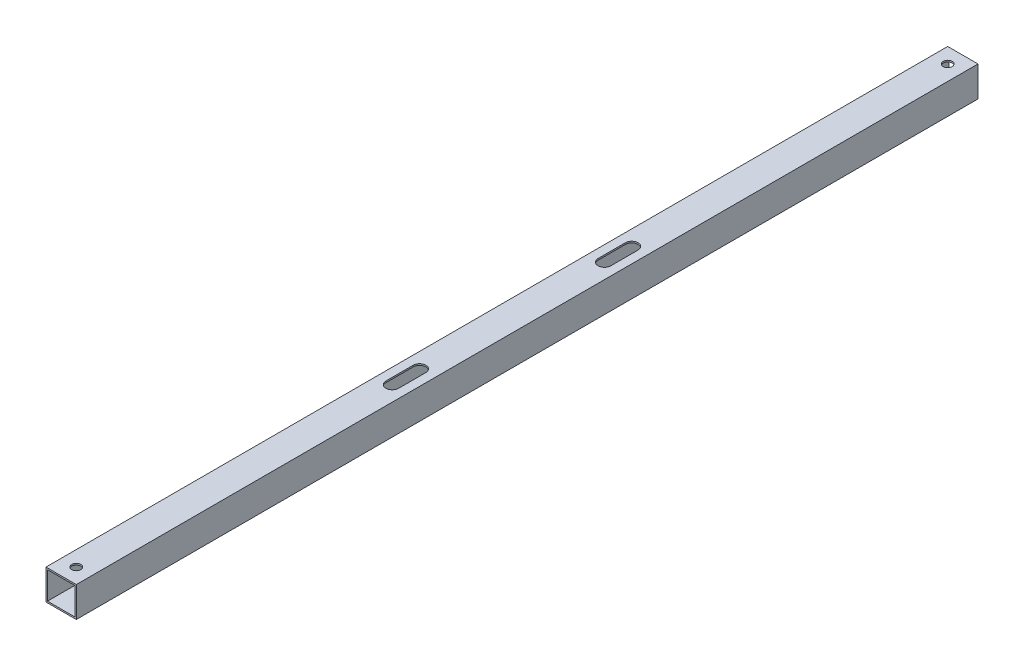
ISO-10303-21;
HEADER;
FILE_DESCRIPTION(('STEP AP214'),'2;1');
FILE_NAME('part.step','',(''),(''),'','','');
FILE_SCHEMA(('AUTOMOTIVE_DESIGN { 1 0 10303 214 1 1 1 1 }'));
ENDSEC;
DATA;
#1=APPLICATION_CONTEXT('core data for automotive mechanical design processes');
#2=APPLICATION_PROTOCOL_DEFINITION('international standard','automotive_design',2000,#1);
#3=PRODUCT_CONTEXT('',#1,'mechanical');
#4=PRODUCT('Part','Part','',(#3));
#5=PRODUCT_RELATED_PRODUCT_CATEGORY('part','',(#4));
#6=PRODUCT_DEFINITION_FORMATION('','',#4);
#7=PRODUCT_DEFINITION_CONTEXT('part definition',#1,'design');
#8=PRODUCT_DEFINITION('design','',#6,#7);
#9=PRODUCT_DEFINITION_SHAPE('','',#8);
#10=(LENGTH_UNIT() NAMED_UNIT(*) SI_UNIT(.MILLI.,.METRE.));
#11=(NAMED_UNIT(*) PLANE_ANGLE_UNIT() SI_UNIT($,.RADIAN.));
#12=(NAMED_UNIT(*) SI_UNIT($,.STERADIAN.) SOLID_ANGLE_UNIT());
#13=UNCERTAINTY_MEASURE_WITH_UNIT(LENGTH_MEASURE(1.E-05),#10,'distance_accuracy_value','');
#14=(GEOMETRIC_REPRESENTATION_CONTEXT(3) GLOBAL_UNCERTAINTY_ASSIGNED_CONTEXT((#13)) GLOBAL_UNIT_ASSIGNED_CONTEXT((#10,
#11,#12)) REPRESENTATION_CONTEXT('',''));
#15=CARTESIAN_POINT('',(0.,0.,0.));
#16=DIRECTION('',(0.,0.,1.));
#17=DIRECTION('',(1.,0.,0.));
#18=AXIS2_PLACEMENT_3D('',#15,#16,#17);
#19=CARTESIAN_POINT('',(-10.,10.,297.5));
#20=DIRECTION('',(0.,-1.,0.));
#21=DIRECTION('',(0.,0.,-1.));
#22=AXIS2_PLACEMENT_3D('',#19,#20,#21);
#23=PLANE('',#22);
#24=DIRECTION('',(-1.,0.,0.));
#25=VECTOR('',#24,1.);
#26=CARTESIAN_POINT('',(-10.,10.,-297.5));
#27=LINE('',#26,#25);
#28=CARTESIAN_POINT('',(10.,10.,-297.5));
#29=VERTEX_POINT('',#28);
#30=CARTESIAN_POINT('',(-10.,10.,-297.5));
#31=VERTEX_POINT('',#30);
#32=EDGE_CURVE('E291',#29,#31,#27,.T.);
#33=ORIENTED_EDGE('',*,*,#32,.T.);
#34=DIRECTION('',(0.,0.,-1.));
#35=VECTOR('',#34,1.);
#36=CARTESIAN_POINT('',(-10.,10.,297.5));
#37=LINE('',#36,#35);
#38=CARTESIAN_POINT('',(-10.,10.,297.5));
#39=VERTEX_POINT('',#38);
#40=EDGE_CURVE('E43',#39,#31,#37,.T.);
#41=ORIENTED_EDGE('',*,*,#40,.F.);
#42=DIRECTION('',(-1.,0.,0.));
#43=VECTOR('',#42,1.);
#44=CARTESIAN_POINT('',(-10.,10.,297.5));
#45=LINE('',#44,#43);
#46=CARTESIAN_POINT('',(10.,10.,297.5));
#47=VERTEX_POINT('',#46);
#48=EDGE_CURVE('E281',#47,#39,#45,.T.);
#49=ORIENTED_EDGE('',*,*,#48,.F.);
#50=DIRECTION('',(0.,0.,-1.));
#51=VECTOR('',#50,1.);
#52=CARTESIAN_POINT('',(10.,10.,297.5));
#53=LINE('',#52,#51);
#54=EDGE_CURVE('E11',#47,#29,#53,.T.);
#55=ORIENTED_EDGE('',*,*,#54,.T.);
#56=EDGE_LOOP('',(#33,#41,#49,#55));
#57=FACE_BOUND('',#56,.T.);
#58=CARTESIAN_POINT('',(0.,10.,287.5));
#59=DIRECTION('',(0.,1.,0.));
#60=DIRECTION('',(0.,0.,1.));
#61=AXIS2_PLACEMENT_3D('',#58,#59,#60);
#62=CIRCLE('',#61,3.);
#63=CARTESIAN_POINT('',(0.,10.,290.5));
#64=VERTEX_POINT('',#63);
#65=EDGE_CURVE('E242',#64,#64,#62,.T.);
#66=ORIENTED_EDGE('',*,*,#65,.F.);
#67=EDGE_LOOP('',(#66));
#68=FACE_BOUND('',#67,.T.);
#69=CARTESIAN_POINT('',(0.,10.,-287.5));
#70=DIRECTION('',(0.,-1.,0.));
#71=DIRECTION('',(0.,0.,-1.));
#72=AXIS2_PLACEMENT_3D('',#69,#70,#71);
#73=CIRCLE('',#72,3.);
#74=CARTESIAN_POINT('',(0.,10.,-290.5));
#75=VERTEX_POINT('',#74);
#76=EDGE_CURVE('E239',#75,#75,#73,.T.);
#77=ORIENTED_EDGE('',*,*,#76,.T.);
#78=EDGE_LOOP('',(#77));
#79=FACE_BOUND('',#78,.T.);
#80=DIRECTION('',(0.,0.,1.));
#81=VECTOR('',#80,1.);
#82=CARTESIAN_POINT('',(4.19999999999995,10.,297.5));
#83=LINE('',#82,#81);
#84=CARTESIAN_POINT('',(4.2,10.,61.));
#85=VERTEX_POINT('',#84);
#86=CARTESIAN_POINT('',(4.2,10.,79.));
#87=VERTEX_POINT('',#86);
#88=EDGE_CURVE('E221',#85,#87,#83,.T.);
#89=ORIENTED_EDGE('',*,*,#88,.T.);
#90=CARTESIAN_POINT('',(0.,10.,79.));
#91=DIRECTION('',(0.,-1.,0.));
#92=DIRECTION('',(0.,0.,-1.));
#93=AXIS2_PLACEMENT_3D('',#90,#91,#92);
#94=CIRCLE('',#93,4.2);
#95=CARTESIAN_POINT('',(-4.2,10.,79.));
#96=VERTEX_POINT('',#95);
#97=EDGE_CURVE('E224',#87,#96,#94,.T.);
#98=ORIENTED_EDGE('',*,*,#97,.T.);
#99=DIRECTION('',(0.,0.,-1.));
#100=VECTOR('',#99,1.);
#101=CARTESIAN_POINT('',(-4.20000000000001,10.,297.5));
#102=LINE('',#101,#100);
#103=CARTESIAN_POINT('',(-4.2,10.,61.));
#104=VERTEX_POINT('',#103);
#105=EDGE_CURVE('E209',#96,#104,#102,.T.);
#106=ORIENTED_EDGE('',*,*,#105,.T.);
#107=CARTESIAN_POINT('',(0.,10.,61.));
#108=DIRECTION('',(0.,-1.,0.));
#109=DIRECTION('',(0.,0.,-1.));
#110=AXIS2_PLACEMENT_3D('',#107,#108,#109);
#111=CIRCLE('',#110,4.2);
#112=EDGE_CURVE('E218',#104,#85,#111,.T.);
#113=ORIENTED_EDGE('',*,*,#112,.T.);
#114=EDGE_LOOP('',(#89,#98,#106,#113));
#115=FACE_BOUND('',#114,.T.);
#116=CARTESIAN_POINT('',(0.,10.,-79.));
#117=DIRECTION('',(0.,-1.,0.));
#118=DIRECTION('',(0.,0.,-1.));
#119=AXIS2_PLACEMENT_3D('',#116,#117,#118);
#120=CIRCLE('',#119,4.2);
#121=CARTESIAN_POINT('',(4.2,10.,-79.));
#122=VERTEX_POINT('',#121);
#123=CARTESIAN_POINT('',(-4.2,10.,-79.));
#124=VERTEX_POINT('',#123);
#125=EDGE_CURVE('E181',#122,#124,#120,.F.);
#126=ORIENTED_EDGE('',*,*,#125,.F.);
#127=DIRECTION('',(0.,0.,-1.));
#128=VECTOR('',#127,1.);
#129=CARTESIAN_POINT('',(4.20000000000009,10.,297.5));
#130=LINE('',#129,#128);
#131=CARTESIAN_POINT('',(4.2,10.,-60.9999999999999));
#132=VERTEX_POINT('',#131);
#133=EDGE_CURVE('E174',#132,#122,#130,.T.);
#134=ORIENTED_EDGE('',*,*,#133,.F.);
#135=CARTESIAN_POINT('',(0.,10.,-61.));
#136=DIRECTION('',(0.,-1.,0.));
#137=DIRECTION('',(0.,0.,-1.));
#138=AXIS2_PLACEMENT_3D('',#135,#136,#137);
#139=CIRCLE('',#138,4.2);
#140=CARTESIAN_POINT('',(-4.2,10.,-61.));
#141=VERTEX_POINT('',#140);
#142=EDGE_CURVE('E155',#141,#132,#139,.F.);
#143=ORIENTED_EDGE('',*,*,#142,.F.);
#144=DIRECTION('',(0.,0.,1.));
#145=VECTOR('',#144,1.);
#146=CARTESIAN_POINT('',(-4.19999999999998,10.,297.5));
#147=LINE('',#146,#145);
#148=EDGE_CURVE('E179',#124,#141,#147,.T.);
#149=ORIENTED_EDGE('',*,*,#148,.F.);
#150=EDGE_LOOP('',(#126,#134,#143,#149));
#151=FACE_BOUND('',#150,.T.);
#152=ADVANCED_FACE('F34',(#57,#68,#79,#115,#151),#23,.F.);
#153=CARTESIAN_POINT('',(-9.,8.99999999999999,297.5));
#154=DIRECTION('',(0.,-1.,0.));
#155=DIRECTION('',(0.,0.,-1.));
#156=AXIS2_PLACEMENT_3D('',#153,#154,#155);
#157=PLANE('',#156);
#158=CARTESIAN_POINT('',(0.,8.99999999999999,79.));
#159=DIRECTION('',(0.,-1.,0.));
#160=DIRECTION('',(0.,0.,-1.));
#161=AXIS2_PLACEMENT_3D('',#158,#159,#160);
#162=CIRCLE('',#161,4.2);
#163=CARTESIAN_POINT('',(4.2,8.99999999999999,79.));
#164=VERTEX_POINT('',#163);
#165=CARTESIAN_POINT('',(-4.2,8.99999999999999,79.));
#166=VERTEX_POINT('',#165);
#167=EDGE_CURVE('E195',#164,#166,#162,.T.);
#168=ORIENTED_EDGE('',*,*,#167,.F.);
#169=DIRECTION('',(0.,0.,1.));
#170=VECTOR('',#169,1.);
#171=CARTESIAN_POINT('',(4.2,8.99999999999999,79.));
#172=LINE('',#171,#170);
#173=CARTESIAN_POINT('',(4.2,8.99999999999999,61.));
#174=VERTEX_POINT('',#173);
#175=EDGE_CURVE('E203',#174,#164,#172,.T.);
#176=ORIENTED_EDGE('',*,*,#175,.F.);
#177=CARTESIAN_POINT('',(0.,8.99999999999999,61.));
#178=DIRECTION('',(0.,-1.,0.));
#179=DIRECTION('',(0.,0.,-1.));
#180=AXIS2_PLACEMENT_3D('',#177,#178,#179);
#181=CIRCLE('',#180,4.2);
#182=CARTESIAN_POINT('',(-4.2,8.99999999999999,61.));
#183=VERTEX_POINT('',#182);
#184=EDGE_CURVE('E200',#183,#174,#181,.T.);
#185=ORIENTED_EDGE('',*,*,#184,.F.);
#186=DIRECTION('',(0.,0.,-1.));
#187=VECTOR('',#186,1.);
#188=CARTESIAN_POINT('',(-4.2,8.99999999999999,79.));
#189=LINE('',#188,#187);
#190=EDGE_CURVE('E197',#166,#183,#189,.T.);
#191=ORIENTED_EDGE('',*,*,#190,.F.);
#192=EDGE_LOOP('',(#168,#176,#185,#191));
#193=FACE_BOUND('',#192,.T.);
#194=CARTESIAN_POINT('',(0.,8.99999999999999,-287.5));
#195=DIRECTION('',(0.,-1.,0.));
#196=DIRECTION('',(0.,0.,-1.));
#197=AXIS2_PLACEMENT_3D('',#194,#195,#196);
#198=CIRCLE('',#197,3.);
#199=CARTESIAN_POINT('',(0.,8.99999999999999,-290.5));
#200=VERTEX_POINT('',#199);
#201=EDGE_CURVE('E38',#200,#200,#198,.F.);
#202=ORIENTED_EDGE('',*,*,#201,.T.);
#203=EDGE_LOOP('',(#202));
#204=FACE_BOUND('',#203,.T.);
#205=CARTESIAN_POINT('',(0.,8.99999999999999,287.5));
#206=DIRECTION('',(0.,-1.,0.));
#207=DIRECTION('',(0.,0.,-1.));
#208=AXIS2_PLACEMENT_3D('',#205,#206,#207);
#209=CIRCLE('',#208,3.);
#210=CARTESIAN_POINT('',(0.,8.99999999999999,284.5));
#211=VERTEX_POINT('',#210);
#212=EDGE_CURVE('E245',#211,#211,#209,.T.);
#213=ORIENTED_EDGE('',*,*,#212,.F.);
#214=EDGE_LOOP('',(#213));
#215=FACE_BOUND('',#214,.T.);
#216=DIRECTION('',(-1.,0.,0.));
#217=VECTOR('',#216,1.);
#218=CARTESIAN_POINT('',(-9.,8.99999999999999,-297.5));
#219=LINE('',#218,#217);
#220=CARTESIAN_POINT('',(9.00000000000001,8.99999999999999,-297.5));
#221=VERTEX_POINT('',#220);
#222=CARTESIAN_POINT('',(-9.,8.99999999999999,-297.5));
#223=VERTEX_POINT('',#222);
#224=EDGE_CURVE('E263',#221,#223,#219,.T.);
#225=ORIENTED_EDGE('',*,*,#224,.F.);
#226=DIRECTION('',(0.,0.,-1.));
#227=VECTOR('',#226,1.);
#228=CARTESIAN_POINT('',(9.00000000000001,8.99999999999999,297.5));
#229=LINE('',#228,#227);
#230=CARTESIAN_POINT('',(9.00000000000001,8.99999999999999,297.5));
#231=VERTEX_POINT('',#230);
#232=EDGE_CURVE('E272',#231,#221,#229,.T.);
#233=ORIENTED_EDGE('',*,*,#232,.F.);
#234=DIRECTION('',(-1.,0.,0.));
#235=VECTOR('',#234,1.);
#236=CARTESIAN_POINT('',(-9.,8.99999999999999,297.5));
#237=LINE('',#236,#235);
#238=CARTESIAN_POINT('',(-9.,8.99999999999999,297.5));
#239=VERTEX_POINT('',#238);
#240=EDGE_CURVE('E251',#231,#239,#237,.T.);
#241=ORIENTED_EDGE('',*,*,#240,.T.);
#242=DIRECTION('',(0.,0.,-1.));
#243=VECTOR('',#242,1.);
#244=CARTESIAN_POINT('',(-9.,8.99999999999999,297.5));
#245=LINE('',#244,#243);
#246=EDGE_CURVE('E270',#239,#223,#245,.T.);
#247=ORIENTED_EDGE('',*,*,#246,.T.);
#248=EDGE_LOOP('',(#225,#233,#241,#247));
#249=FACE_BOUND('',#248,.T.);
#250=DIRECTION('',(0.,0.,-1.));
#251=VECTOR('',#250,1.);
#252=CARTESIAN_POINT('',(4.2,8.99999999999999,-79.));
#253=LINE('',#252,#251);
#254=CARTESIAN_POINT('',(4.2,8.99999999999999,-61.));
#255=VERTEX_POINT('',#254);
#256=CARTESIAN_POINT('',(4.2,8.99999999999999,-79.));
#257=VERTEX_POINT('',#256);
#258=EDGE_CURVE('E161',#255,#257,#253,.T.);
#259=ORIENTED_EDGE('',*,*,#258,.T.);
#260=CARTESIAN_POINT('',(0.,8.99999999999999,-79.));
#261=DIRECTION('',(0.,1.,0.));
#262=DIRECTION('',(0.,0.,1.));
#263=AXIS2_PLACEMENT_3D('',#260,#261,#262);
#264=CIRCLE('',#263,4.2);
#265=CARTESIAN_POINT('',(-4.2,8.99999999999999,-79.));
#266=VERTEX_POINT('',#265);
#267=EDGE_CURVE('E59',#257,#266,#264,.T.);
#268=ORIENTED_EDGE('',*,*,#267,.T.);
#269=DIRECTION('',(0.,0.,1.));
#270=VECTOR('',#269,1.);
#271=CARTESIAN_POINT('',(-4.2,8.99999999999999,-79.));
#272=LINE('',#271,#270);
#273=CARTESIAN_POINT('',(-4.2,8.99999999999999,-61.));
#274=VERTEX_POINT('',#273);
#275=EDGE_CURVE('E167',#266,#274,#272,.T.);
#276=ORIENTED_EDGE('',*,*,#275,.T.);
#277=CARTESIAN_POINT('',(0.,8.99999999999999,-61.));
#278=DIRECTION('',(0.,1.,0.));
#279=DIRECTION('',(0.,0.,1.));
#280=AXIS2_PLACEMENT_3D('',#277,#278,#279);
#281=CIRCLE('',#280,4.2);
#282=EDGE_CURVE('E152',#274,#255,#281,.T.);
#283=ORIENTED_EDGE('',*,*,#282,.T.);
#284=EDGE_LOOP('',(#259,#268,#276,#283));
#285=FACE_BOUND('',#284,.T.);
#286=ADVANCED_FACE('F165',(#193,#204,#215,#249,#285),#157,.T.);
#287=CARTESIAN_POINT('',(0.,0.,297.5));
#288=DIRECTION('',(0.,0.,-1.));
#289=DIRECTION('',(-1.,0.,0.));
#290=AXIS2_PLACEMENT_3D('',#287,#288,#289);
#291=PLANE('',#290);
#292=DIRECTION('',(0.,1.,0.));
#293=VECTOR('',#292,1.);
#294=CARTESIAN_POINT('',(10.,-10.,297.5));
#295=LINE('',#294,#293);
#296=CARTESIAN_POINT('',(10.,-10.,297.5));
#297=VERTEX_POINT('',#296);
#298=EDGE_CURVE('E278',#297,#47,#295,.T.);
#299=ORIENTED_EDGE('',*,*,#298,.T.);
#300=ORIENTED_EDGE('',*,*,#48,.T.);
#301=DIRECTION('',(0.,-1.,0.));
#302=VECTOR('',#301,1.);
#303=CARTESIAN_POINT('',(-10.,-10.,297.5));
#304=LINE('',#303,#302);
#305=CARTESIAN_POINT('',(-10.,-10.,297.5));
#306=VERTEX_POINT('',#305);
#307=EDGE_CURVE('E284',#39,#306,#304,.T.);
#308=ORIENTED_EDGE('',*,*,#307,.T.);
#309=DIRECTION('',(1.,0.,0.));
#310=VECTOR('',#309,1.);
#311=CARTESIAN_POINT('',(-10.,-10.,297.5));
#312=LINE('',#311,#310);
#313=EDGE_CURVE('E286',#306,#297,#312,.T.);
#314=ORIENTED_EDGE('',*,*,#313,.T.);
#315=EDGE_LOOP('',(#299,#300,#308,#314));
#316=FACE_BOUND('',#315,.T.);
#317=DIRECTION('',(1.,0.,0.));
#318=VECTOR('',#317,1.);
#319=CARTESIAN_POINT('',(-9.,-9.,297.5));
#320=LINE('',#319,#318);
#321=CARTESIAN_POINT('',(-9.,-9.,297.5));
#322=VERTEX_POINT('',#321);
#323=CARTESIAN_POINT('',(9.00000000000001,-9.,297.5));
#324=VERTEX_POINT('',#323);
#325=EDGE_CURVE('E246',#322,#324,#320,.T.);
#326=ORIENTED_EDGE('',*,*,#325,.F.);
#327=DIRECTION('',(0.,-1.,0.));
#328=VECTOR('',#327,1.);
#329=CARTESIAN_POINT('',(-9.,-9.,297.5));
#330=LINE('',#329,#328);
#331=EDGE_CURVE('E254',#239,#322,#330,.T.);
#332=ORIENTED_EDGE('',*,*,#331,.F.);
#333=ORIENTED_EDGE('',*,*,#240,.F.);
#334=DIRECTION('',(0.,1.,0.));
#335=VECTOR('',#334,1.);
#336=CARTESIAN_POINT('',(9.00000000000001,-9.,297.5));
#337=LINE('',#336,#335);
#338=EDGE_CURVE('E248',#324,#231,#337,.T.);
#339=ORIENTED_EDGE('',*,*,#338,.F.);
#340=EDGE_LOOP('',(#326,#332,#333,#339));
#341=FACE_BOUND('',#340,.T.);
#342=ADVANCED_FACE('F310',(#316,#341),#291,.F.);
#343=CARTESIAN_POINT('',(0.,0.,-297.5));
#344=DIRECTION('',(0.,0.,-1.));
#345=DIRECTION('',(-1.,0.,0.));
#346=AXIS2_PLACEMENT_3D('',#343,#344,#345);
#347=PLANE('',#346);
#348=DIRECTION('',(0.,1.,0.));
#349=VECTOR('',#348,1.);
#350=CARTESIAN_POINT('',(10.,-10.,-297.5));
#351=LINE('',#350,#349);
#352=CARTESIAN_POINT('',(10.,-10.,-297.5));
#353=VERTEX_POINT('',#352);
#354=EDGE_CURVE('E277',#353,#29,#351,.T.);
#355=ORIENTED_EDGE('',*,*,#354,.F.);
#356=DIRECTION('',(1.,0.,0.));
#357=VECTOR('',#356,1.);
#358=CARTESIAN_POINT('',(-10.,-10.,-297.5));
#359=LINE('',#358,#357);
#360=CARTESIAN_POINT('',(-10.,-10.,-297.5));
#361=VERTEX_POINT('',#360);
#362=EDGE_CURVE('E282',#361,#353,#359,.T.);
#363=ORIENTED_EDGE('',*,*,#362,.F.);
#364=DIRECTION('',(0.,-1.,0.));
#365=VECTOR('',#364,1.);
#366=CARTESIAN_POINT('',(-10.,-10.,-297.5));
#367=LINE('',#366,#365);
#368=EDGE_CURVE('E293',#31,#361,#367,.T.);
#369=ORIENTED_EDGE('',*,*,#368,.F.);
#370=ORIENTED_EDGE('',*,*,#32,.F.);
#371=EDGE_LOOP('',(#355,#363,#369,#370));
#372=FACE_BOUND('',#371,.T.);
#373=DIRECTION('',(0.,-1.,0.));
#374=VECTOR('',#373,1.);
#375=CARTESIAN_POINT('',(-9.,-9.,-297.5));
#376=LINE('',#375,#374);
#377=CARTESIAN_POINT('',(-9.,-9.,-297.5));
#378=VERTEX_POINT('',#377);
#379=EDGE_CURVE('E249',#223,#378,#376,.T.);
#380=ORIENTED_EDGE('',*,*,#379,.T.);
#381=DIRECTION('',(1.,0.,0.));
#382=VECTOR('',#381,1.);
#383=CARTESIAN_POINT('',(-9.,-9.,-297.5));
#384=LINE('',#383,#382);
#385=CARTESIAN_POINT('',(9.00000000000001,-9.,-297.5));
#386=VERTEX_POINT('',#385);
#387=EDGE_CURVE('E257',#378,#386,#384,.T.);
#388=ORIENTED_EDGE('',*,*,#387,.T.);
#389=DIRECTION('',(0.,1.,0.));
#390=VECTOR('',#389,1.);
#391=CARTESIAN_POINT('',(9.00000000000001,-9.,-297.5));
#392=LINE('',#391,#390);
#393=EDGE_CURVE('E260',#386,#221,#392,.T.);
#394=ORIENTED_EDGE('',*,*,#393,.T.);
#395=ORIENTED_EDGE('',*,*,#224,.T.);
#396=EDGE_LOOP('',(#380,#388,#394,#395));
#397=FACE_BOUND('',#396,.T.);
#398=ADVANCED_FACE('F318',(#372,#397),#347,.T.);
#399=CARTESIAN_POINT('',(10.,-10.,297.5));
#400=DIRECTION('',(-1.,0.,0.));
#401=DIRECTION('',(0.,0.,1.));
#402=AXIS2_PLACEMENT_3D('',#399,#400,#401);
#403=PLANE('',#402);
#404=ORIENTED_EDGE('',*,*,#354,.T.);
#405=ORIENTED_EDGE('',*,*,#54,.F.);
#406=ORIENTED_EDGE('',*,*,#298,.F.);
#407=DIRECTION('',(0.,0.,-1.));
#408=VECTOR('',#407,1.);
#409=CARTESIAN_POINT('',(10.,-10.,297.5));
#410=LINE('',#409,#408);
#411=EDGE_CURVE('E288',#297,#353,#410,.T.);
#412=ORIENTED_EDGE('',*,*,#411,.T.);
#413=EDGE_LOOP('',(#404,#405,#406,#412));
#414=FACE_BOUND('',#413,.T.);
#415=ADVANCED_FACE('F36',(#414),#403,.F.);
#416=CARTESIAN_POINT('',(-10.,-10.,297.5));
#417=DIRECTION('',(1.,0.,0.));
#418=DIRECTION('',(0.,0.,-1.));
#419=AXIS2_PLACEMENT_3D('',#416,#417,#418);
#420=PLANE('',#419);
#421=ORIENTED_EDGE('',*,*,#368,.T.);
#422=DIRECTION('',(0.,0.,-1.));
#423=VECTOR('',#422,1.);
#424=CARTESIAN_POINT('',(-10.,-10.,297.5));
#425=LINE('',#424,#423);
#426=EDGE_CURVE('E298',#306,#361,#425,.T.);
#427=ORIENTED_EDGE('',*,*,#426,.F.);
#428=ORIENTED_EDGE('',*,*,#307,.F.);
#429=ORIENTED_EDGE('',*,*,#40,.T.);
#430=EDGE_LOOP('',(#421,#427,#428,#429));
#431=FACE_BOUND('',#430,.T.);
#432=ADVANCED_FACE('F347',(#431),#420,.F.);
#433=CARTESIAN_POINT('',(-10.,-10.,297.5));
#434=DIRECTION('',(0.,1.,0.));
#435=DIRECTION('',(0.,0.,1.));
#436=AXIS2_PLACEMENT_3D('',#433,#434,#435);
#437=PLANE('',#436);
#438=CARTESIAN_POINT('',(0.,-10.,-79.));
#439=DIRECTION('',(0.,1.,0.));
#440=DIRECTION('',(0.,0.,1.));
#441=AXIS2_PLACEMENT_3D('',#438,#439,#440);
#442=CIRCLE('',#441,2.);
#443=CARTESIAN_POINT('',(0.,-10.,-77.));
#444=VERTEX_POINT('',#443);
#445=EDGE_CURVE('E192',#444,#444,#442,.F.);
#446=ORIENTED_EDGE('',*,*,#445,.F.);
#447=EDGE_LOOP('',(#446));
#448=FACE_BOUND('',#447,.T.);
#449=CARTESIAN_POINT('',(0.,-10.,-61.));
#450=DIRECTION('',(0.,1.,0.));
#451=DIRECTION('',(0.,0.,1.));
#452=AXIS2_PLACEMENT_3D('',#449,#450,#451);
#453=CIRCLE('',#452,2.);
#454=CARTESIAN_POINT('',(0.,-10.,-59.));
#455=VERTEX_POINT('',#454);
#456=EDGE_CURVE('E187',#455,#455,#453,.F.);
#457=ORIENTED_EDGE('',*,*,#456,.F.);
#458=EDGE_LOOP('',(#457));
#459=FACE_BOUND('',#458,.T.);
#460=CARTESIAN_POINT('',(0.,-10.,79.));
#461=DIRECTION('',(0.,1.,0.));
#462=DIRECTION('',(0.,0.,1.));
#463=AXIS2_PLACEMENT_3D('',#460,#461,#462);
#464=CIRCLE('',#463,2.);
#465=CARTESIAN_POINT('',(0.,-10.,81.));
#466=VERTEX_POINT('',#465);
#467=EDGE_CURVE('E236',#466,#466,#464,.T.);
#468=ORIENTED_EDGE('',*,*,#467,.T.);
#469=EDGE_LOOP('',(#468));
#470=FACE_BOUND('',#469,.T.);
#471=CARTESIAN_POINT('',(0.,-10.,61.));
#472=DIRECTION('',(0.,1.,0.));
#473=DIRECTION('',(0.,0.,1.));
#474=AXIS2_PLACEMENT_3D('',#471,#472,#473);
#475=CIRCLE('',#474,2.);
#476=CARTESIAN_POINT('',(0.,-10.,63.));
#477=VERTEX_POINT('',#476);
#478=EDGE_CURVE('E231',#477,#477,#475,.T.);
#479=ORIENTED_EDGE('',*,*,#478,.T.);
#480=EDGE_LOOP('',(#479));
#481=FACE_BOUND('',#480,.T.);
#482=ORIENTED_EDGE('',*,*,#362,.T.);
#483=ORIENTED_EDGE('',*,*,#411,.F.);
#484=ORIENTED_EDGE('',*,*,#313,.F.);
#485=ORIENTED_EDGE('',*,*,#426,.T.);
#486=EDGE_LOOP('',(#482,#483,#484,#485));
#487=FACE_BOUND('',#486,.T.);
#488=ADVANCED_FACE('F350',(#448,#459,#470,#481,#487),#437,.F.);
#489=CARTESIAN_POINT('',(-9.,-9.,297.5));
#490=DIRECTION('',(0.,1.,0.));
#491=DIRECTION('',(0.,0.,1.));
#492=AXIS2_PLACEMENT_3D('',#489,#490,#491);
#493=PLANE('',#492);
#494=CARTESIAN_POINT('',(0.,-9.,-79.));
#495=DIRECTION('',(0.,-1.,0.));
#496=DIRECTION('',(0.,0.,-1.));
#497=AXIS2_PLACEMENT_3D('',#494,#495,#496);
#498=CIRCLE('',#497,2.);
#499=CARTESIAN_POINT('',(0.,-9.,-81.));
#500=VERTEX_POINT('',#499);
#501=EDGE_CURVE('E184',#500,#500,#498,.T.);
#502=ORIENTED_EDGE('',*,*,#501,.T.);
#503=EDGE_LOOP('',(#502));
#504=FACE_BOUND('',#503,.T.);
#505=CARTESIAN_POINT('',(0.,-9.,-61.));
#506=DIRECTION('',(0.,-1.,0.));
#507=DIRECTION('',(0.,0.,-1.));
#508=AXIS2_PLACEMENT_3D('',#505,#506,#507);
#509=CIRCLE('',#508,2.);
#510=CARTESIAN_POINT('',(0.,-9.,-63.));
#511=VERTEX_POINT('',#510);
#512=EDGE_CURVE('E183',#511,#511,#509,.T.);
#513=ORIENTED_EDGE('',*,*,#512,.T.);
#514=EDGE_LOOP('',(#513));
#515=FACE_BOUND('',#514,.T.);
#516=CARTESIAN_POINT('',(0.,-9.,79.));
#517=DIRECTION('',(0.,1.,0.));
#518=DIRECTION('',(0.,0.,1.));
#519=AXIS2_PLACEMENT_3D('',#516,#517,#518);
#520=CIRCLE('',#519,2.);
#521=CARTESIAN_POINT('',(0.,-9.,81.));
#522=VERTEX_POINT('',#521);
#523=EDGE_CURVE('E228',#522,#522,#520,.T.);
#524=ORIENTED_EDGE('',*,*,#523,.F.);
#525=EDGE_LOOP('',(#524));
#526=FACE_BOUND('',#525,.T.);
#527=CARTESIAN_POINT('',(0.,-9.,61.));
#528=DIRECTION('',(0.,1.,0.));
#529=DIRECTION('',(0.,0.,1.));
#530=AXIS2_PLACEMENT_3D('',#527,#528,#529);
#531=CIRCLE('',#530,2.);
#532=CARTESIAN_POINT('',(0.,-9.,63.));
#533=VERTEX_POINT('',#532);
#534=EDGE_CURVE('E227',#533,#533,#531,.T.);
#535=ORIENTED_EDGE('',*,*,#534,.F.);
#536=EDGE_LOOP('',(#535));
#537=FACE_BOUND('',#536,.T.);
#538=ORIENTED_EDGE('',*,*,#387,.F.);
#539=DIRECTION('',(0.,0.,-1.));
#540=VECTOR('',#539,1.);
#541=CARTESIAN_POINT('',(-9.,-9.,297.5));
#542=LINE('',#541,#540);
#543=EDGE_CURVE('E256',#322,#378,#542,.T.);
#544=ORIENTED_EDGE('',*,*,#543,.F.);
#545=ORIENTED_EDGE('',*,*,#325,.T.);
#546=DIRECTION('',(0.,0.,-1.));
#547=VECTOR('',#546,1.);
#548=CARTESIAN_POINT('',(9.00000000000001,-9.,297.5));
#549=LINE('',#548,#547);
#550=EDGE_CURVE('E274',#324,#386,#549,.T.);
#551=ORIENTED_EDGE('',*,*,#550,.T.);
#552=EDGE_LOOP('',(#538,#544,#545,#551));
#553=FACE_BOUND('',#552,.T.);
#554=ADVANCED_FACE('F324',(#504,#515,#526,#537,#553),#493,.T.);
#555=CARTESIAN_POINT('',(9.00000000000001,-9.,297.5));
#556=DIRECTION('',(-1.,0.,0.));
#557=DIRECTION('',(0.,-1.,0.));
#558=AXIS2_PLACEMENT_3D('',#555,#556,#557);
#559=PLANE('',#558);
#560=ORIENTED_EDGE('',*,*,#393,.F.);
#561=ORIENTED_EDGE('',*,*,#550,.F.);
#562=ORIENTED_EDGE('',*,*,#338,.T.);
#563=ORIENTED_EDGE('',*,*,#232,.T.);
#564=EDGE_LOOP('',(#560,#561,#562,#563));
#565=FACE_BOUND('',#564,.T.);
#566=ADVANCED_FACE('F321',(#565),#559,.T.);
#567=CARTESIAN_POINT('',(-9.,-9.,297.5));
#568=DIRECTION('',(1.,0.,0.));
#569=DIRECTION('',(0.,0.,-1.));
#570=AXIS2_PLACEMENT_3D('',#567,#568,#569);
#571=PLANE('',#570);
#572=ORIENTED_EDGE('',*,*,#379,.F.);
#573=ORIENTED_EDGE('',*,*,#246,.F.);
#574=ORIENTED_EDGE('',*,*,#331,.T.);
#575=ORIENTED_EDGE('',*,*,#543,.T.);
#576=EDGE_LOOP('',(#572,#573,#574,#575));
#577=FACE_BOUND('',#576,.T.);
#578=ADVANCED_FACE('F330',(#577),#571,.T.);
#579=CARTESIAN_POINT('',(0.,0.,287.5));
#580=DIRECTION('',(0.,1.,0.));
#581=DIRECTION('',(0.,0.,1.));
#582=AXIS2_PLACEMENT_3D('',#579,#580,#581);
#583=CYLINDRICAL_SURFACE('',#582,3.);
#584=ORIENTED_EDGE('',*,*,#212,.T.);
#585=EDGE_LOOP('',(#584));
#586=FACE_BOUND('',#585,.T.);
#587=ORIENTED_EDGE('',*,*,#65,.T.);
#588=EDGE_LOOP('',(#587));
#589=FACE_BOUND('',#588,.T.);
#590=ADVANCED_FACE('F305',(#586,#589),#583,.F.);
#591=CARTESIAN_POINT('',(0.,0.,-287.5));
#592=DIRECTION('',(0.,1.,0.));
#593=DIRECTION('',(0.,0.,1.));
#594=AXIS2_PLACEMENT_3D('',#591,#592,#593);
#595=CYLINDRICAL_SURFACE('',#594,3.);
#596=ORIENTED_EDGE('',*,*,#201,.F.);
#597=EDGE_LOOP('',(#596));
#598=FACE_BOUND('',#597,.T.);
#599=ORIENTED_EDGE('',*,*,#76,.F.);
#600=EDGE_LOOP('',(#599));
#601=FACE_BOUND('',#600,.T.);
#602=ADVANCED_FACE('F337',(#598,#601),#595,.F.);
#603=CARTESIAN_POINT('',(0.,-19.,61.));
#604=DIRECTION('',(0.,1.,0.));
#605=DIRECTION('',(0.,0.,1.));
#606=AXIS2_PLACEMENT_3D('',#603,#604,#605);
#607=CYLINDRICAL_SURFACE('',#606,2.);
#608=ORIENTED_EDGE('',*,*,#534,.T.);
#609=EDGE_LOOP('',(#608));
#610=FACE_BOUND('',#609,.T.);
#611=ORIENTED_EDGE('',*,*,#478,.F.);
#612=EDGE_LOOP('',(#611));
#613=FACE_BOUND('',#612,.T.);
#614=ADVANCED_FACE('F374',(#610,#613),#607,.F.);
#615=CARTESIAN_POINT('',(0.,-19.,79.));
#616=DIRECTION('',(0.,1.,0.));
#617=DIRECTION('',(0.,0.,1.));
#618=AXIS2_PLACEMENT_3D('',#615,#616,#617);
#619=CYLINDRICAL_SURFACE('',#618,2.);
#620=ORIENTED_EDGE('',*,*,#523,.T.);
#621=EDGE_LOOP('',(#620));
#622=FACE_BOUND('',#621,.T.);
#623=ORIENTED_EDGE('',*,*,#467,.F.);
#624=EDGE_LOOP('',(#623));
#625=FACE_BOUND('',#624,.T.);
#626=ADVANCED_FACE('F377',(#622,#625),#619,.F.);
#627=CARTESIAN_POINT('',(0.,19.,79.));
#628=DIRECTION('',(0.,-1.,0.));
#629=DIRECTION('',(0.,0.,-1.));
#630=AXIS2_PLACEMENT_3D('',#627,#628,#629);
#631=CYLINDRICAL_SURFACE('',#630,4.2);
#632=DIRECTION('',(0.,-1.,0.));
#633=VECTOR('',#632,1.);
#634=CARTESIAN_POINT('',(4.2,19.,79.));
#635=LINE('',#634,#633);
#636=EDGE_CURVE('E207',#87,#164,#635,.T.);
#637=ORIENTED_EDGE('',*,*,#636,.T.);
#638=ORIENTED_EDGE('',*,*,#167,.T.);
#639=DIRECTION('',(0.,-1.,0.));
#640=VECTOR('',#639,1.);
#641=CARTESIAN_POINT('',(-4.2,19.,79.));
#642=LINE('',#641,#640);
#643=EDGE_CURVE('E206',#96,#166,#642,.T.);
#644=ORIENTED_EDGE('',*,*,#643,.F.);
#645=ORIENTED_EDGE('',*,*,#97,.F.);
#646=EDGE_LOOP('',(#637,#638,#644,#645));
#647=FACE_BOUND('',#646,.T.);
#648=ADVANCED_FACE('F452',(#647),#631,.F.);
#649=CARTESIAN_POINT('',(4.2,19.,79.));
#650=DIRECTION('',(1.,0.,0.));
#651=DIRECTION('',(0.,0.,-1.));
#652=AXIS2_PLACEMENT_3D('',#649,#650,#651);
#653=PLANE('',#652);
#654=DIRECTION('',(0.,-1.,0.));
#655=VECTOR('',#654,1.);
#656=CARTESIAN_POINT('',(4.2,19.,61.));
#657=LINE('',#656,#655);
#658=EDGE_CURVE('E210',#85,#174,#657,.T.);
#659=ORIENTED_EDGE('',*,*,#658,.T.);
#660=ORIENTED_EDGE('',*,*,#175,.T.);
#661=ORIENTED_EDGE('',*,*,#636,.F.);
#662=ORIENTED_EDGE('',*,*,#88,.F.);
#663=EDGE_LOOP('',(#659,#660,#661,#662));
#664=FACE_BOUND('',#663,.T.);
#665=ADVANCED_FACE('F462',(#664),#653,.F.);
#666=CARTESIAN_POINT('',(0.,19.,61.));
#667=DIRECTION('',(0.,-1.,0.));
#668=DIRECTION('',(0.,0.,-1.));
#669=AXIS2_PLACEMENT_3D('',#666,#667,#668);
#670=CYLINDRICAL_SURFACE('',#669,4.2);
#671=DIRECTION('',(0.,-1.,0.));
#672=VECTOR('',#671,1.);
#673=CARTESIAN_POINT('',(-4.2,19.,61.));
#674=LINE('',#673,#672);
#675=EDGE_CURVE('E212',#104,#183,#674,.T.);
#676=ORIENTED_EDGE('',*,*,#675,.T.);
#677=ORIENTED_EDGE('',*,*,#184,.T.);
#678=ORIENTED_EDGE('',*,*,#658,.F.);
#679=ORIENTED_EDGE('',*,*,#112,.F.);
#680=EDGE_LOOP('',(#676,#677,#678,#679));
#681=FACE_BOUND('',#680,.T.);
#682=ADVANCED_FACE('F472',(#681),#670,.F.);
#683=CARTESIAN_POINT('',(-4.2,19.,79.));
#684=DIRECTION('',(-1.,0.,0.));
#685=DIRECTION('',(0.,0.,1.));
#686=AXIS2_PLACEMENT_3D('',#683,#684,#685);
#687=PLANE('',#686);
#688=ORIENTED_EDGE('',*,*,#643,.T.);
#689=ORIENTED_EDGE('',*,*,#190,.T.);
#690=ORIENTED_EDGE('',*,*,#675,.F.);
#691=ORIENTED_EDGE('',*,*,#105,.F.);
#692=EDGE_LOOP('',(#688,#689,#690,#691));
#693=FACE_BOUND('',#692,.T.);
#694=ADVANCED_FACE('F481',(#693),#687,.F.);
#695=CARTESIAN_POINT('',(0.,-19.,-61.));
#696=DIRECTION('',(0.,1.,0.));
#697=DIRECTION('',(0.,0.,1.));
#698=AXIS2_PLACEMENT_3D('',#695,#696,#697);
#699=CYLINDRICAL_SURFACE('',#698,2.);
#700=ORIENTED_EDGE('',*,*,#512,.F.);
#701=EDGE_LOOP('',(#700));
#702=FACE_BOUND('',#701,.T.);
#703=ORIENTED_EDGE('',*,*,#456,.T.);
#704=EDGE_LOOP('',(#703));
#705=FACE_BOUND('',#704,.T.);
#706=ADVANCED_FACE('F490',(#702,#705),#699,.F.);
#707=CARTESIAN_POINT('',(0.,-19.,-79.));
#708=DIRECTION('',(0.,1.,0.));
#709=DIRECTION('',(0.,0.,1.));
#710=AXIS2_PLACEMENT_3D('',#707,#708,#709);
#711=CYLINDRICAL_SURFACE('',#710,2.);
#712=ORIENTED_EDGE('',*,*,#501,.F.);
#713=EDGE_LOOP('',(#712));
#714=FACE_BOUND('',#713,.T.);
#715=ORIENTED_EDGE('',*,*,#445,.T.);
#716=EDGE_LOOP('',(#715));
#717=FACE_BOUND('',#716,.T.);
#718=ADVANCED_FACE('F500',(#714,#717),#711,.F.);
#719=CARTESIAN_POINT('',(0.,19.,-79.));
#720=DIRECTION('',(0.,-1.,0.));
#721=DIRECTION('',(0.,0.,-1.));
#722=AXIS2_PLACEMENT_3D('',#719,#720,#721);
#723=CYLINDRICAL_SURFACE('',#722,4.2);
#724=ORIENTED_EDGE('',*,*,#125,.T.);
#725=DIRECTION('',(0.,-1.,0.));
#726=VECTOR('',#725,1.);
#727=CARTESIAN_POINT('',(-4.2,19.,-79.));
#728=LINE('',#727,#726);
#729=EDGE_CURVE('E172',#124,#266,#728,.T.);
#730=ORIENTED_EDGE('',*,*,#729,.T.);
#731=ORIENTED_EDGE('',*,*,#267,.F.);
#732=DIRECTION('',(0.,-1.,0.));
#733=VECTOR('',#732,1.);
#734=CARTESIAN_POINT('',(4.2,19.,-79.));
#735=LINE('',#734,#733);
#736=EDGE_CURVE('E158',#122,#257,#735,.T.);
#737=ORIENTED_EDGE('',*,*,#736,.F.);
#738=EDGE_LOOP('',(#724,#730,#731,#737));
#739=FACE_BOUND('',#738,.T.);
#740=ADVANCED_FACE('F507',(#739),#723,.F.);
#741=CARTESIAN_POINT('',(-4.2,19.,-79.));
#742=DIRECTION('',(1.,0.,0.));
#743=DIRECTION('',(0.,0.,-1.));
#744=AXIS2_PLACEMENT_3D('',#741,#742,#743);
#745=PLANE('',#744);
#746=ORIENTED_EDGE('',*,*,#148,.T.);
#747=DIRECTION('',(0.,-1.,0.));
#748=VECTOR('',#747,1.);
#749=CARTESIAN_POINT('',(-4.2,19.,-61.));
#750=LINE('',#749,#748);
#751=EDGE_CURVE('E157',#141,#274,#750,.T.);
#752=ORIENTED_EDGE('',*,*,#751,.T.);
#753=ORIENTED_EDGE('',*,*,#275,.F.);
#754=ORIENTED_EDGE('',*,*,#729,.F.);
#755=EDGE_LOOP('',(#746,#752,#753,#754));
#756=FACE_BOUND('',#755,.T.);
#757=ADVANCED_FACE('F515',(#756),#745,.T.);
#758=CARTESIAN_POINT('',(0.,19.,-61.));
#759=DIRECTION('',(0.,-1.,0.));
#760=DIRECTION('',(0.,0.,-1.));
#761=AXIS2_PLACEMENT_3D('',#758,#759,#760);
#762=CYLINDRICAL_SURFACE('',#761,4.2);
#763=ORIENTED_EDGE('',*,*,#142,.T.);
#764=DIRECTION('',(0.,-1.,0.));
#765=VECTOR('',#764,1.);
#766=CARTESIAN_POINT('',(4.2,19.,-61.));
#767=LINE('',#766,#765);
#768=EDGE_CURVE('E51',#132,#255,#767,.T.);
#769=ORIENTED_EDGE('',*,*,#768,.T.);
#770=ORIENTED_EDGE('',*,*,#282,.F.);
#771=ORIENTED_EDGE('',*,*,#751,.F.);
#772=EDGE_LOOP('',(#763,#769,#770,#771));
#773=FACE_BOUND('',#772,.T.);
#774=ADVANCED_FACE('F149',(#773),#762,.F.);
#775=CARTESIAN_POINT('',(4.2,19.,-79.));
#776=DIRECTION('',(-1.,0.,0.));
#777=DIRECTION('',(0.,0.,1.));
#778=AXIS2_PLACEMENT_3D('',#775,#776,#777);
#779=PLANE('',#778);
#780=ORIENTED_EDGE('',*,*,#133,.T.);
#781=ORIENTED_EDGE('',*,*,#736,.T.);
#782=ORIENTED_EDGE('',*,*,#258,.F.);
#783=ORIENTED_EDGE('',*,*,#768,.F.);
#784=EDGE_LOOP('',(#780,#781,#782,#783));
#785=FACE_BOUND('',#784,.T.);
#786=ADVANCED_FACE('F162',(#785),#779,.T.);
#787=CLOSED_SHELL('',(#152,#286,#342,#398,#415,#432,#488,#554,#566,#578,#590,#602,#614,#626,
#648,#665,#682,#694,#706,#718,#740,#757,#774,#786));
#788=MANIFOLD_SOLID_BREP('B2',#787);
#789=ADVANCED_BREP_SHAPE_REPRESENTATION('',(#18,#788),#14);
#790=SHAPE_DEFINITION_REPRESENTATION(#9,#789);
ENDSEC;
END-ISO-10303-21;
